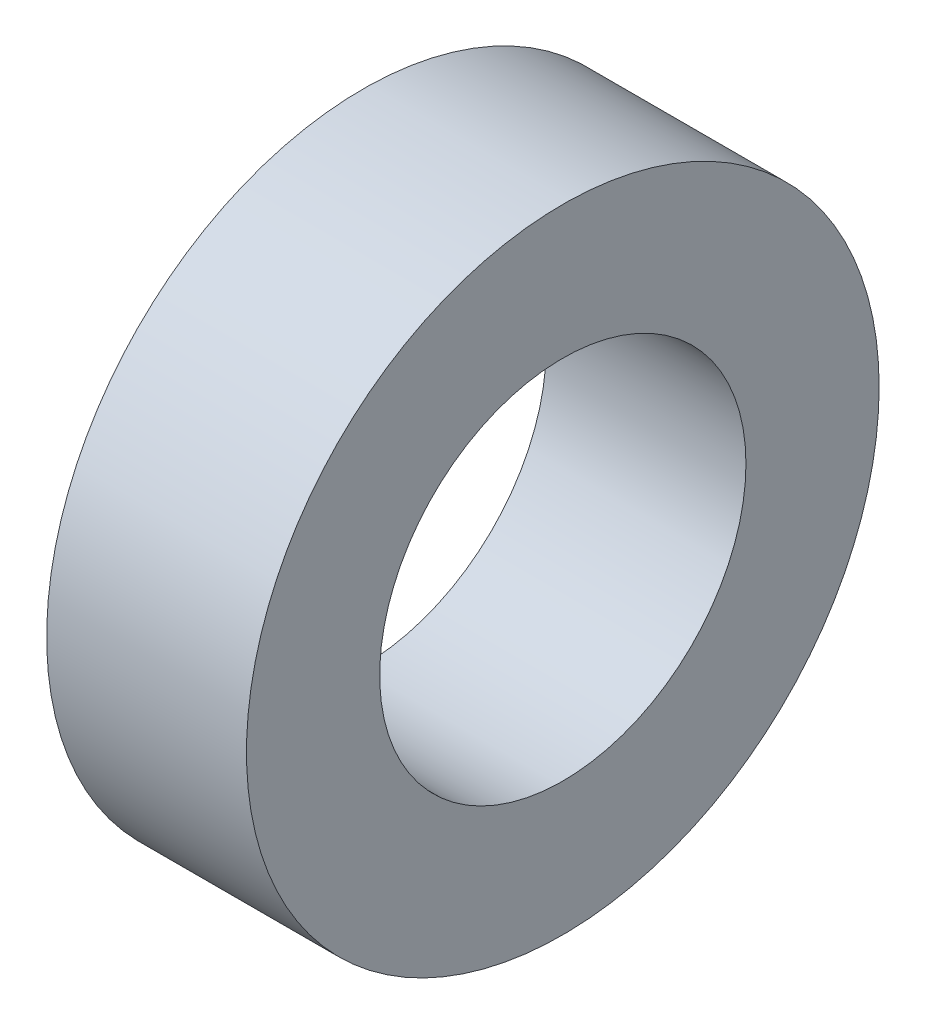
ISO-10303-21;
HEADER;
FILE_DESCRIPTION(('STEP AP214'),'2;1');
FILE_NAME('part.step','',(''),(''),'','','');
FILE_SCHEMA(('AUTOMOTIVE_DESIGN { 1 0 10303 214 1 1 1 1 }'));
ENDSEC;
DATA;
#1=APPLICATION_CONTEXT('core data for automotive mechanical design processes');
#2=APPLICATION_PROTOCOL_DEFINITION('international standard','automotive_design',2000,#1);
#3=PRODUCT_CONTEXT('',#1,'mechanical');
#4=PRODUCT('Part','Part','',(#3));
#5=PRODUCT_RELATED_PRODUCT_CATEGORY('part','',(#4));
#6=PRODUCT_DEFINITION_FORMATION('','',#4);
#7=PRODUCT_DEFINITION_CONTEXT('part definition',#1,'design');
#8=PRODUCT_DEFINITION('design','',#6,#7);
#9=PRODUCT_DEFINITION_SHAPE('','',#8);
#10=(LENGTH_UNIT() NAMED_UNIT(*) SI_UNIT(.MILLI.,.METRE.));
#11=(NAMED_UNIT(*) PLANE_ANGLE_UNIT() SI_UNIT($,.RADIAN.));
#12=(NAMED_UNIT(*) SI_UNIT($,.STERADIAN.) SOLID_ANGLE_UNIT());
#13=UNCERTAINTY_MEASURE_WITH_UNIT(LENGTH_MEASURE(1.E-05),#10,'distance_accuracy_value','');
#14=(GEOMETRIC_REPRESENTATION_CONTEXT(3) GLOBAL_UNCERTAINTY_ASSIGNED_CONTEXT((#13)) GLOBAL_UNIT_ASSIGNED_CONTEXT((#10,
#11,#12)) REPRESENTATION_CONTEXT('',''));
#15=CARTESIAN_POINT('',(0.,0.,0.));
#16=DIRECTION('',(0.,0.,1.));
#17=DIRECTION('',(1.,0.,0.));
#18=AXIS2_PLACEMENT_3D('',#15,#16,#17);
#19=CARTESIAN_POINT('',(3.,0.,0.));
#20=DIRECTION('',(1.,0.,0.));
#21=DIRECTION('',(0.,0.,-1.));
#22=AXIS2_PLACEMENT_3D('',#19,#20,#21);
#23=PLANE('',#22);
#24=CARTESIAN_POINT('',(3.,0.,0.));
#25=DIRECTION('',(1.,0.,0.));
#26=DIRECTION('',(0.,0.,-1.));
#27=AXIS2_PLACEMENT_3D('',#24,#25,#26);
#28=CIRCLE('',#27,4.75);
#29=CARTESIAN_POINT('',(3.,0.,-4.75));
#30=VERTEX_POINT('',#29);
#31=EDGE_CURVE('E10',#30,#30,#28,.T.);
#32=ORIENTED_EDGE('',*,*,#31,.T.);
#33=EDGE_LOOP('',(#32));
#34=FACE_BOUND('',#33,.T.);
#35=CARTESIAN_POINT('',(3.,0.,0.));
#36=DIRECTION('',(1.,0.,0.));
#37=DIRECTION('',(0.,0.,-1.));
#38=AXIS2_PLACEMENT_3D('',#35,#36,#37);
#39=CIRCLE('',#38,2.75);
#40=CARTESIAN_POINT('',(3.,0.,-2.75));
#41=VERTEX_POINT('',#40);
#42=EDGE_CURVE('E42',#41,#41,#39,.T.);
#43=ORIENTED_EDGE('',*,*,#42,.F.);
#44=EDGE_LOOP('',(#43));
#45=FACE_BOUND('',#44,.T.);
#46=ADVANCED_FACE('F31',(#34,#45),#23,.T.);
#47=CARTESIAN_POINT('',(0.,0.,0.));
#48=DIRECTION('',(1.,0.,0.));
#49=DIRECTION('',(0.,0.,-1.));
#50=AXIS2_PLACEMENT_3D('',#47,#48,#49);
#51=PLANE('',#50);
#52=CARTESIAN_POINT('',(0.,0.,0.));
#53=DIRECTION('',(1.,0.,0.));
#54=DIRECTION('',(0.,0.,-1.));
#55=AXIS2_PLACEMENT_3D('',#52,#53,#54);
#56=CIRCLE('',#55,4.75);
#57=CARTESIAN_POINT('',(0.,0.,-4.75));
#58=VERTEX_POINT('',#57);
#59=EDGE_CURVE('E35',#58,#58,#56,.T.);
#60=ORIENTED_EDGE('',*,*,#59,.F.);
#61=EDGE_LOOP('',(#60));
#62=FACE_BOUND('',#61,.T.);
#63=CARTESIAN_POINT('',(0.,0.,0.));
#64=DIRECTION('',(1.,0.,0.));
#65=DIRECTION('',(0.,0.,-1.));
#66=AXIS2_PLACEMENT_3D('',#63,#64,#65);
#67=CIRCLE('',#66,2.75);
#68=CARTESIAN_POINT('',(0.,0.,-2.75));
#69=VERTEX_POINT('',#68);
#70=EDGE_CURVE('E44',#69,#69,#67,.T.);
#71=ORIENTED_EDGE('',*,*,#70,.T.);
#72=EDGE_LOOP('',(#71));
#73=FACE_BOUND('',#72,.T.);
#74=ADVANCED_FACE('F54',(#62,#73),#51,.F.);
#75=CARTESIAN_POINT('',(3.,0.,0.));
#76=DIRECTION('',(-1.,0.,0.));
#77=DIRECTION('',(0.,0.,1.));
#78=AXIS2_PLACEMENT_3D('',#75,#76,#77);
#79=CYLINDRICAL_SURFACE('',#78,4.75);
#80=ORIENTED_EDGE('',*,*,#31,.F.);
#81=EDGE_LOOP('',(#80));
#82=FACE_BOUND('',#81,.T.);
#83=ORIENTED_EDGE('',*,*,#59,.T.);
#84=EDGE_LOOP('',(#83));
#85=FACE_BOUND('',#84,.T.);
#86=ADVANCED_FACE('F33',(#82,#85),#79,.T.);
#87=CARTESIAN_POINT('',(3.,0.,0.));
#88=DIRECTION('',(-1.,0.,0.));
#89=DIRECTION('',(0.,0.,1.));
#90=AXIS2_PLACEMENT_3D('',#87,#88,#89);
#91=CYLINDRICAL_SURFACE('',#90,2.75);
#92=ORIENTED_EDGE('',*,*,#42,.T.);
#93=EDGE_LOOP('',(#92));
#94=FACE_BOUND('',#93,.T.);
#95=ORIENTED_EDGE('',*,*,#70,.F.);
#96=EDGE_LOOP('',(#95));
#97=FACE_BOUND('',#96,.T.);
#98=ADVANCED_FACE('F50',(#94,#97),#91,.F.);
#99=CLOSED_SHELL('',(#46,#74,#86,#98));
#100=MANIFOLD_SOLID_BREP('B2',#99);
#101=ADVANCED_BREP_SHAPE_REPRESENTATION('',(#18,#100),#14);
#102=SHAPE_DEFINITION_REPRESENTATION(#9,#101);
ENDSEC;
END-ISO-10303-21;
